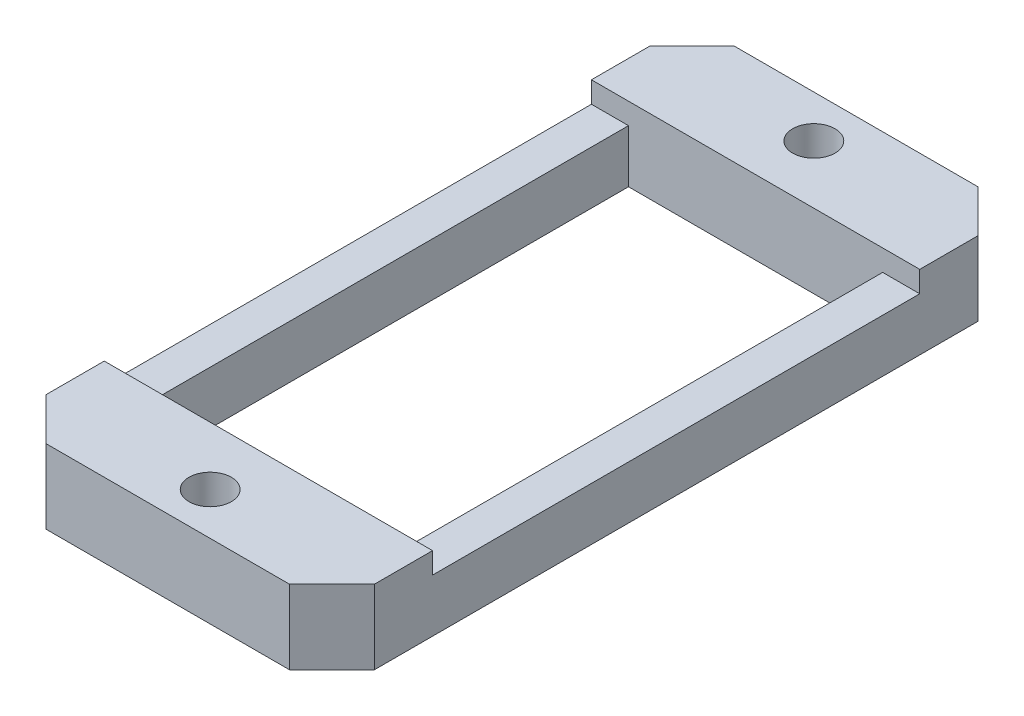
ISO-10303-21;
HEADER;
FILE_DESCRIPTION(('STEP AP214'),'2;1');
FILE_NAME('part.step','',(''),(''),'','','');
FILE_SCHEMA(('AUTOMOTIVE_DESIGN { 1 0 10303 214 1 1 1 1 }'));
ENDSEC;
DATA;
#1=APPLICATION_CONTEXT('core data for automotive mechanical design processes');
#2=APPLICATION_PROTOCOL_DEFINITION('international standard','automotive_design',2000,#1);
#3=PRODUCT_CONTEXT('',#1,'mechanical');
#4=PRODUCT('Part','Part','',(#3));
#5=PRODUCT_RELATED_PRODUCT_CATEGORY('part','',(#4));
#6=PRODUCT_DEFINITION_FORMATION('','',#4);
#7=PRODUCT_DEFINITION_CONTEXT('part definition',#1,'design');
#8=PRODUCT_DEFINITION('design','',#6,#7);
#9=PRODUCT_DEFINITION_SHAPE('','',#8);
#10=(LENGTH_UNIT() NAMED_UNIT(*) SI_UNIT(.MILLI.,.METRE.));
#11=(NAMED_UNIT(*) PLANE_ANGLE_UNIT() SI_UNIT($,.RADIAN.));
#12=(NAMED_UNIT(*) SI_UNIT($,.STERADIAN.) SOLID_ANGLE_UNIT());
#13=UNCERTAINTY_MEASURE_WITH_UNIT(LENGTH_MEASURE(1.E-05),#10,'distance_accuracy_value','');
#14=(GEOMETRIC_REPRESENTATION_CONTEXT(3) GLOBAL_UNCERTAINTY_ASSIGNED_CONTEXT((#13)) GLOBAL_UNIT_ASSIGNED_CONTEXT((#10,
#11,#12)) REPRESENTATION_CONTEXT('',''));
#15=CARTESIAN_POINT('',(0.,0.,0.));
#16=DIRECTION('',(0.,0.,1.));
#17=DIRECTION('',(1.,0.,0.));
#18=AXIS2_PLACEMENT_3D('',#15,#16,#17);
#19=CARTESIAN_POINT('',(7.75,2.5,-4.75));
#20=DIRECTION('',(0.,-1.,0.));
#21=DIRECTION('',(0.,0.,-1.));
#22=AXIS2_PLACEMENT_3D('',#19,#20,#21);
#23=PLANE('',#22);
#24=DIRECTION('',(-1.,0.,0.));
#25=VECTOR('',#24,1.);
#26=CARTESIAN_POINT('',(7.75,2.5,-27.75));
#27=LINE('',#26,#25);
#28=CARTESIAN_POINT('',(7.75,2.5,-27.75));
#29=VERTEX_POINT('',#28);
#30=CARTESIAN_POINT('',(6.,2.5,-27.75));
#31=VERTEX_POINT('',#30);
#32=EDGE_CURVE('E256',#29,#31,#27,.T.);
#33=ORIENTED_EDGE('',*,*,#32,.T.);
#34=DIRECTION('',(0.,0.,1.));
#35=VECTOR('',#34,1.);
#36=CARTESIAN_POINT('',(6.,2.5,-4.75));
#37=LINE('',#36,#35);
#38=CARTESIAN_POINT('',(6.,2.5,-4.75));
#39=VERTEX_POINT('',#38);
#40=EDGE_CURVE('E198',#31,#39,#37,.T.);
#41=ORIENTED_EDGE('',*,*,#40,.T.);
#42=DIRECTION('',(-1.,0.,0.));
#43=VECTOR('',#42,1.);
#44=CARTESIAN_POINT('',(7.75,2.5,-4.75));
#45=LINE('',#44,#43);
#46=CARTESIAN_POINT('',(7.75,2.5,-4.75));
#47=VERTEX_POINT('',#46);
#48=EDGE_CURVE('E252',#47,#39,#45,.T.);
#49=ORIENTED_EDGE('',*,*,#48,.F.);
#50=DIRECTION('',(0.,0.,1.));
#51=VECTOR('',#50,1.);
#52=CARTESIAN_POINT('',(7.75,2.5,-4.75));
#53=LINE('',#52,#51);
#54=EDGE_CURVE('E214',#29,#47,#53,.T.);
#55=ORIENTED_EDGE('',*,*,#54,.F.);
#56=EDGE_LOOP('',(#33,#41,#49,#55));
#57=FACE_BOUND('',#56,.T.);
#58=ADVANCED_FACE('F39',(#57),#23,.F.);
#59=CARTESIAN_POINT('',(7.75,0.,0.));
#60=DIRECTION('',(0.,0.,-1.));
#61=DIRECTION('',(-1.,0.,0.));
#62=AXIS2_PLACEMENT_3D('',#59,#60,#61);
#63=PLANE('',#62);
#64=DIRECTION('',(-1.,0.,0.));
#65=VECTOR('',#64,1.);
#66=CARTESIAN_POINT('',(7.75,3.5,0.));
#67=LINE('',#66,#65);
#68=CARTESIAN_POINT('',(5.74999999999999,3.5,0.));
#69=VERTEX_POINT('',#68);
#70=CARTESIAN_POINT('',(-5.74999999999999,3.5,0.));
#71=VERTEX_POINT('',#70);
#72=EDGE_CURVE('E224',#69,#71,#67,.T.);
#73=ORIENTED_EDGE('',*,*,#72,.T.);
#74=DIRECTION('',(0.,-1.,0.));
#75=VECTOR('',#74,1.);
#76=CARTESIAN_POINT('',(-5.74999999999999,0.,0.));
#77=LINE('',#76,#75);
#78=CARTESIAN_POINT('',(-5.74999999999999,0.,0.));
#79=VERTEX_POINT('',#78);
#80=EDGE_CURVE('E279',#71,#79,#77,.T.);
#81=ORIENTED_EDGE('',*,*,#80,.T.);
#82=DIRECTION('',(-1.,0.,0.));
#83=VECTOR('',#82,1.);
#84=CARTESIAN_POINT('',(7.75,0.,0.));
#85=LINE('',#84,#83);
#86=CARTESIAN_POINT('',(5.74999999999999,0.,0.));
#87=VERTEX_POINT('',#86);
#88=EDGE_CURVE('E272',#87,#79,#85,.T.);
#89=ORIENTED_EDGE('',*,*,#88,.F.);
#90=DIRECTION('',(0.,1.,0.));
#91=VECTOR('',#90,1.);
#92=CARTESIAN_POINT('',(5.74999999999999,0.,0.));
#93=LINE('',#92,#91);
#94=EDGE_CURVE('E276',#87,#69,#93,.T.);
#95=ORIENTED_EDGE('',*,*,#94,.T.);
#96=EDGE_LOOP('',(#73,#81,#89,#95));
#97=FACE_BOUND('',#96,.T.);
#98=ADVANCED_FACE('F354',(#97),#63,.F.);
#99=CARTESIAN_POINT('',(7.75,0.,0.));
#100=DIRECTION('',(0.,1.,0.));
#101=DIRECTION('',(0.,0.,1.));
#102=AXIS2_PLACEMENT_3D('',#99,#100,#101);
#103=PLANE('',#102);
#104=CARTESIAN_POINT('',(0.,0.,-30.5));
#105=DIRECTION('',(0.,-1.,0.));
#106=DIRECTION('',(0.,0.,-1.));
#107=AXIS2_PLACEMENT_3D('',#104,#105,#106);
#108=CIRCLE('',#107,1.);
#109=CARTESIAN_POINT('',(0.,0.,-31.5));
#110=VERTEX_POINT('',#109);
#111=EDGE_CURVE('E377',#110,#110,#108,.T.);
#112=ORIENTED_EDGE('',*,*,#111,.F.);
#113=EDGE_LOOP('',(#112));
#114=FACE_BOUND('',#113,.T.);
#115=CARTESIAN_POINT('',(0.,0.,-2.));
#116=DIRECTION('',(0.,-1.,0.));
#117=DIRECTION('',(0.,0.,-1.));
#118=AXIS2_PLACEMENT_3D('',#115,#116,#117);
#119=CIRCLE('',#118,1.);
#120=CARTESIAN_POINT('',(0.,0.,-3.));
#121=VERTEX_POINT('',#120);
#122=EDGE_CURVE('E374',#121,#121,#119,.T.);
#123=ORIENTED_EDGE('',*,*,#122,.F.);
#124=EDGE_LOOP('',(#123));
#125=FACE_BOUND('',#124,.T.);
#126=DIRECTION('',(-1.,0.,0.));
#127=VECTOR('',#126,1.);
#128=CARTESIAN_POINT('',(-6.,0.,-4.75));
#129=LINE('',#128,#127);
#130=CARTESIAN_POINT('',(6.,0.,-4.75));
#131=VERTEX_POINT('',#130);
#132=CARTESIAN_POINT('',(-6.,0.,-4.75));
#133=VERTEX_POINT('',#132);
#134=EDGE_CURVE('E170',#131,#133,#129,.T.);
#135=ORIENTED_EDGE('',*,*,#134,.F.);
#136=DIRECTION('',(0.,0.,1.));
#137=VECTOR('',#136,1.);
#138=CARTESIAN_POINT('',(6.,0.,-4.75));
#139=LINE('',#138,#137);
#140=CARTESIAN_POINT('',(6.,0.,-27.75));
#141=VERTEX_POINT('',#140);
#142=EDGE_CURVE('E177',#141,#131,#139,.T.);
#143=ORIENTED_EDGE('',*,*,#142,.F.);
#144=DIRECTION('',(1.,0.,0.));
#145=VECTOR('',#144,1.);
#146=CARTESIAN_POINT('',(-6.,0.,-27.75));
#147=LINE('',#146,#145);
#148=CARTESIAN_POINT('',(-6.,0.,-27.75));
#149=VERTEX_POINT('',#148);
#150=EDGE_CURVE('E182',#149,#141,#147,.T.);
#151=ORIENTED_EDGE('',*,*,#150,.F.);
#152=DIRECTION('',(0.,0.,-1.));
#153=VECTOR('',#152,1.);
#154=CARTESIAN_POINT('',(-6.,0.,-4.75));
#155=LINE('',#154,#153);
#156=EDGE_CURVE('E158',#133,#149,#155,.T.);
#157=ORIENTED_EDGE('',*,*,#156,.F.);
#158=EDGE_LOOP('',(#135,#143,#151,#157));
#159=FACE_BOUND('',#158,.T.);
#160=ORIENTED_EDGE('',*,*,#88,.T.);
#161=DIRECTION('',(-0.707106781186548,0.,-0.707106781186548));
#162=VECTOR('',#161,1.);
#163=CARTESIAN_POINT('',(-5.74999999999999,0.,0.));
#164=LINE('',#163,#162);
#165=CARTESIAN_POINT('',(-7.75,0.,-2.00000000000001));
#166=VERTEX_POINT('',#165);
#167=EDGE_CURVE('E292',#79,#166,#164,.T.);
#168=ORIENTED_EDGE('',*,*,#167,.T.);
#169=DIRECTION('',(0.,0.,-1.));
#170=VECTOR('',#169,1.);
#171=CARTESIAN_POINT('',(-7.75,0.,0.));
#172=LINE('',#171,#170);
#173=CARTESIAN_POINT('',(-7.75,0.,-30.5));
#174=VERTEX_POINT('',#173);
#175=EDGE_CURVE('E202',#166,#174,#172,.T.);
#176=ORIENTED_EDGE('',*,*,#175,.T.);
#177=DIRECTION('',(0.707106781186548,0.,-0.707106781186548));
#178=VECTOR('',#177,1.);
#179=CARTESIAN_POINT('',(-5.74999999999999,0.,-32.5));
#180=LINE('',#179,#178);
#181=CARTESIAN_POINT('',(-5.74999999999999,0.,-32.5));
#182=VERTEX_POINT('',#181);
#183=EDGE_CURVE('E289',#174,#182,#180,.T.);
#184=ORIENTED_EDGE('',*,*,#183,.T.);
#185=DIRECTION('',(-1.,0.,0.));
#186=VECTOR('',#185,1.);
#187=CARTESIAN_POINT('',(7.75,0.,-32.5));
#188=LINE('',#187,#186);
#189=CARTESIAN_POINT('',(5.74999999999999,0.,-32.5));
#190=VERTEX_POINT('',#189);
#191=EDGE_CURVE('E268',#190,#182,#188,.T.);
#192=ORIENTED_EDGE('',*,*,#191,.F.);
#193=DIRECTION('',(-0.707106781186548,0.,-0.707106781186547));
#194=VECTOR('',#193,1.);
#195=CARTESIAN_POINT('',(7.75,0.,-30.5));
#196=LINE('',#195,#194);
#197=CARTESIAN_POINT('',(7.75,0.,-30.5));
#198=VERTEX_POINT('',#197);
#199=EDGE_CURVE('E286',#190,#198,#196,.F.);
#200=ORIENTED_EDGE('',*,*,#199,.T.);
#201=DIRECTION('',(0.,0.,-1.));
#202=VECTOR('',#201,1.);
#203=CARTESIAN_POINT('',(7.75,0.,0.));
#204=LINE('',#203,#202);
#205=CARTESIAN_POINT('',(7.75,0.,-2.00000000000001));
#206=VERTEX_POINT('',#205);
#207=EDGE_CURVE('E203',#206,#198,#204,.T.);
#208=ORIENTED_EDGE('',*,*,#207,.F.);
#209=DIRECTION('',(0.707106781186548,0.,-0.707106781186548));
#210=VECTOR('',#209,1.);
#211=CARTESIAN_POINT('',(7.75,0.,-2.00000000000001));
#212=LINE('',#211,#210);
#213=EDGE_CURVE('E283',#206,#87,#212,.F.);
#214=ORIENTED_EDGE('',*,*,#213,.T.);
#215=EDGE_LOOP('',(#160,#168,#176,#184,#192,#200,#208,#214));
#216=FACE_BOUND('',#215,.T.);
#217=ADVANCED_FACE('F179',(#114,#125,#159,#216),#103,.F.);
#218=CARTESIAN_POINT('',(7.75,0.,-32.5));
#219=DIRECTION('',(0.,0.,1.));
#220=DIRECTION('',(1.,0.,0.));
#221=AXIS2_PLACEMENT_3D('',#218,#219,#220);
#222=PLANE('',#221);
#223=ORIENTED_EDGE('',*,*,#191,.T.);
#224=DIRECTION('',(0.,1.,0.));
#225=VECTOR('',#224,1.);
#226=CARTESIAN_POINT('',(-5.74999999999999,3.5,-32.5));
#227=LINE('',#226,#225);
#228=CARTESIAN_POINT('',(-5.74999999999999,3.5,-32.5));
#229=VERTEX_POINT('',#228);
#230=EDGE_CURVE('E310',#182,#229,#227,.T.);
#231=ORIENTED_EDGE('',*,*,#230,.T.);
#232=DIRECTION('',(-1.,0.,0.));
#233=VECTOR('',#232,1.);
#234=CARTESIAN_POINT('',(7.75,3.5,-32.5));
#235=LINE('',#234,#233);
#236=CARTESIAN_POINT('',(5.74999999999999,3.5,-32.5));
#237=VERTEX_POINT('',#236);
#238=EDGE_CURVE('E264',#237,#229,#235,.T.);
#239=ORIENTED_EDGE('',*,*,#238,.F.);
#240=DIRECTION('',(0.,-1.,0.));
#241=VECTOR('',#240,1.);
#242=CARTESIAN_POINT('',(5.74999999999999,0.,-32.5));
#243=LINE('',#242,#241);
#244=EDGE_CURVE('E307',#237,#190,#243,.T.);
#245=ORIENTED_EDGE('',*,*,#244,.T.);
#246=EDGE_LOOP('',(#223,#231,#239,#245));
#247=FACE_BOUND('',#246,.T.);
#248=ADVANCED_FACE('F392',(#247),#222,.F.);
#249=CARTESIAN_POINT('',(7.75,3.5,-27.75));
#250=DIRECTION('',(0.,-1.,0.));
#251=DIRECTION('',(0.,0.,-1.));
#252=AXIS2_PLACEMENT_3D('',#249,#250,#251);
#253=PLANE('',#252);
#254=CARTESIAN_POINT('',(0.,3.5,-30.5));
#255=DIRECTION('',(0.,-1.,0.));
#256=DIRECTION('',(0.,0.,-1.));
#257=AXIS2_PLACEMENT_3D('',#254,#255,#256);
#258=CIRCLE('',#257,1.);
#259=CARTESIAN_POINT('',(0.,3.5,-31.5));
#260=VERTEX_POINT('',#259);
#261=EDGE_CURVE('E381',#260,#260,#258,.T.);
#262=ORIENTED_EDGE('',*,*,#261,.T.);
#263=EDGE_LOOP('',(#262));
#264=FACE_BOUND('',#263,.T.);
#265=ORIENTED_EDGE('',*,*,#238,.T.);
#266=DIRECTION('',(-0.707106781186548,0.,0.707106781186548));
#267=VECTOR('',#266,1.);
#268=CARTESIAN_POINT('',(-5.74999999999999,3.5,-32.5));
#269=LINE('',#268,#267);
#270=CARTESIAN_POINT('',(-7.75,3.5,-30.5));
#271=VERTEX_POINT('',#270);
#272=EDGE_CURVE('E62',#229,#271,#269,.T.);
#273=ORIENTED_EDGE('',*,*,#272,.T.);
#274=DIRECTION('',(0.,0.,1.));
#275=VECTOR('',#274,1.);
#276=CARTESIAN_POINT('',(-7.75,3.5,-27.75));
#277=LINE('',#276,#275);
#278=CARTESIAN_POINT('',(-7.75,3.5,-27.75));
#279=VERTEX_POINT('',#278);
#280=EDGE_CURVE('E228',#271,#279,#277,.T.);
#281=ORIENTED_EDGE('',*,*,#280,.T.);
#282=DIRECTION('',(-1.,0.,0.));
#283=VECTOR('',#282,1.);
#284=CARTESIAN_POINT('',(7.75,3.5,-27.75));
#285=LINE('',#284,#283);
#286=CARTESIAN_POINT('',(7.75,3.5,-27.75));
#287=VERTEX_POINT('',#286);
#288=EDGE_CURVE('E260',#287,#279,#285,.T.);
#289=ORIENTED_EDGE('',*,*,#288,.F.);
#290=DIRECTION('',(0.,0.,1.));
#291=VECTOR('',#290,1.);
#292=CARTESIAN_POINT('',(7.75,3.5,-27.75));
#293=LINE('',#292,#291);
#294=CARTESIAN_POINT('',(7.75,3.5,-30.5));
#295=VERTEX_POINT('',#294);
#296=EDGE_CURVE('E207',#295,#287,#293,.T.);
#297=ORIENTED_EDGE('',*,*,#296,.F.);
#298=DIRECTION('',(0.707106781186548,0.,0.707106781186547));
#299=VECTOR('',#298,1.);
#300=CARTESIAN_POINT('',(7.75,3.5,-30.5));
#301=LINE('',#300,#299);
#302=EDGE_CURVE('E55',#295,#237,#301,.F.);
#303=ORIENTED_EDGE('',*,*,#302,.T.);
#304=EDGE_LOOP('',(#265,#273,#281,#289,#297,#303));
#305=FACE_BOUND('',#304,.T.);
#306=ADVANCED_FACE('F332',(#264,#305),#253,.F.);
#307=CARTESIAN_POINT('',(7.75,3.5,-27.75));
#308=DIRECTION('',(0.,0.,-1.));
#309=DIRECTION('',(-1.,0.,0.));
#310=AXIS2_PLACEMENT_3D('',#307,#308,#309);
#311=PLANE('',#310);
#312=CARTESIAN_POINT('',(-6.,2.5,-27.75));
#313=VERTEX_POINT('',#312);
#314=CARTESIAN_POINT('',(-7.75,2.5,-27.75));
#315=VERTEX_POINT('',#314);
#316=EDGE_CURVE('E255',#313,#315,#27,.T.);
#317=ORIENTED_EDGE('',*,*,#316,.F.);
#318=DIRECTION('',(0.,-1.,0.));
#319=VECTOR('',#318,1.);
#320=CARTESIAN_POINT('',(-6.,3.5,-27.75));
#321=LINE('',#320,#319);
#322=EDGE_CURVE('E165',#313,#149,#321,.T.);
#323=ORIENTED_EDGE('',*,*,#322,.T.);
#324=ORIENTED_EDGE('',*,*,#150,.T.);
#325=DIRECTION('',(0.,-1.,0.));
#326=VECTOR('',#325,1.);
#327=CARTESIAN_POINT('',(6.,3.5,-27.75));
#328=LINE('',#327,#326);
#329=EDGE_CURVE('E189',#31,#141,#328,.T.);
#330=ORIENTED_EDGE('',*,*,#329,.F.);
#331=ORIENTED_EDGE('',*,*,#32,.F.);
#332=DIRECTION('',(0.,-1.,0.));
#333=VECTOR('',#332,1.);
#334=CARTESIAN_POINT('',(7.75,3.5,-27.75));
#335=LINE('',#334,#333);
#336=EDGE_CURVE('E211',#287,#29,#335,.T.);
#337=ORIENTED_EDGE('',*,*,#336,.F.);
#338=ORIENTED_EDGE('',*,*,#288,.T.);
#339=DIRECTION('',(0.,-1.,0.));
#340=VECTOR('',#339,1.);
#341=CARTESIAN_POINT('',(-7.75,3.5,-27.75));
#342=LINE('',#341,#340);
#343=EDGE_CURVE('E231',#279,#315,#342,.T.);
#344=ORIENTED_EDGE('',*,*,#343,.T.);
#345=EDGE_LOOP('',(#317,#323,#324,#330,#331,#337,#338,#344));
#346=FACE_BOUND('',#345,.T.);
#347=ADVANCED_FACE('F340',(#346),#311,.F.);
#348=CARTESIAN_POINT('',(-6.,2.5,-4.75));
#349=VERTEX_POINT('',#348);
#350=CARTESIAN_POINT('',(-7.75,2.5,-4.75));
#351=VERTEX_POINT('',#350);
#352=EDGE_CURVE('E251',#349,#351,#45,.T.);
#353=ORIENTED_EDGE('',*,*,#352,.F.);
#354=DIRECTION('',(0.,0.,-1.));
#355=VECTOR('',#354,1.);
#356=CARTESIAN_POINT('',(-6.,2.5,-4.75));
#357=LINE('',#356,#355);
#358=EDGE_CURVE('E161',#349,#313,#357,.T.);
#359=ORIENTED_EDGE('',*,*,#358,.T.);
#360=ORIENTED_EDGE('',*,*,#316,.T.);
#361=DIRECTION('',(0.,0.,1.));
#362=VECTOR('',#361,1.);
#363=CARTESIAN_POINT('',(-7.75,2.5,-4.75));
#364=LINE('',#363,#362);
#365=EDGE_CURVE('E235',#315,#351,#364,.T.);
#366=ORIENTED_EDGE('',*,*,#365,.T.);
#367=EDGE_LOOP('',(#353,#359,#360,#366));
#368=FACE_BOUND('',#367,.T.);
#369=ADVANCED_FACE('F366',(#368),#23,.F.);
#370=CARTESIAN_POINT('',(7.75,3.5,-4.75));
#371=DIRECTION('',(0.,0.,1.));
#372=DIRECTION('',(1.,0.,0.));
#373=AXIS2_PLACEMENT_3D('',#370,#371,#372);
#374=PLANE('',#373);
#375=DIRECTION('',(0.,1.,0.));
#376=VECTOR('',#375,1.);
#377=CARTESIAN_POINT('',(-7.75,3.5,-4.75));
#378=LINE('',#377,#376);
#379=CARTESIAN_POINT('',(-7.75,3.5,-4.75));
#380=VERTEX_POINT('',#379);
#381=EDGE_CURVE('E239',#351,#380,#378,.T.);
#382=ORIENTED_EDGE('',*,*,#381,.T.);
#383=DIRECTION('',(-1.,0.,0.));
#384=VECTOR('',#383,1.);
#385=CARTESIAN_POINT('',(7.75,3.5,-4.75));
#386=LINE('',#385,#384);
#387=CARTESIAN_POINT('',(7.75,3.5,-4.75));
#388=VERTEX_POINT('',#387);
#389=EDGE_CURVE('E248',#388,#380,#386,.T.);
#390=ORIENTED_EDGE('',*,*,#389,.F.);
#391=DIRECTION('',(0.,1.,0.));
#392=VECTOR('',#391,1.);
#393=CARTESIAN_POINT('',(7.75,3.5,-4.75));
#394=LINE('',#393,#392);
#395=EDGE_CURVE('E217',#47,#388,#394,.T.);
#396=ORIENTED_EDGE('',*,*,#395,.F.);
#397=ORIENTED_EDGE('',*,*,#48,.T.);
#398=DIRECTION('',(0.,-1.,0.));
#399=VECTOR('',#398,1.);
#400=CARTESIAN_POINT('',(6.,3.5,-4.75));
#401=LINE('',#400,#399);
#402=EDGE_CURVE('E166',#39,#131,#401,.T.);
#403=ORIENTED_EDGE('',*,*,#402,.T.);
#404=ORIENTED_EDGE('',*,*,#134,.T.);
#405=DIRECTION('',(0.,-1.,0.));
#406=VECTOR('',#405,1.);
#407=CARTESIAN_POINT('',(-6.,3.5,-4.75));
#408=LINE('',#407,#406);
#409=EDGE_CURVE('E154',#349,#133,#408,.T.);
#410=ORIENTED_EDGE('',*,*,#409,.F.);
#411=ORIENTED_EDGE('',*,*,#352,.T.);
#412=EDGE_LOOP('',(#382,#390,#396,#397,#403,#404,#410,#411));
#413=FACE_BOUND('',#412,.T.);
#414=ADVANCED_FACE('F172',(#413),#374,.F.);
#415=CARTESIAN_POINT('',(7.75,3.5,0.));
#416=DIRECTION('',(0.,-1.,0.));
#417=DIRECTION('',(0.,0.,-1.));
#418=AXIS2_PLACEMENT_3D('',#415,#416,#417);
#419=PLANE('',#418);
#420=CARTESIAN_POINT('',(0.,3.5,-2.));
#421=DIRECTION('',(0.,-1.,0.));
#422=DIRECTION('',(0.,0.,-1.));
#423=AXIS2_PLACEMENT_3D('',#420,#421,#422);
#424=CIRCLE('',#423,1.);
#425=CARTESIAN_POINT('',(0.,3.5,-3.));
#426=VERTEX_POINT('',#425);
#427=EDGE_CURVE('E371',#426,#426,#424,.T.);
#428=ORIENTED_EDGE('',*,*,#427,.T.);
#429=EDGE_LOOP('',(#428));
#430=FACE_BOUND('',#429,.T.);
#431=DIRECTION('',(0.,0.,1.));
#432=VECTOR('',#431,1.);
#433=CARTESIAN_POINT('',(-7.75,3.5,0.));
#434=LINE('',#433,#432);
#435=CARTESIAN_POINT('',(-7.75,3.5,-2.00000000000001));
#436=VERTEX_POINT('',#435);
#437=EDGE_CURVE('E208',#380,#436,#434,.T.);
#438=ORIENTED_EDGE('',*,*,#437,.T.);
#439=DIRECTION('',(0.707106781186548,0.,0.707106781186548));
#440=VECTOR('',#439,1.);
#441=CARTESIAN_POINT('',(-5.74999999999999,3.5,0.));
#442=LINE('',#441,#440);
#443=EDGE_CURVE('E304',#436,#71,#442,.T.);
#444=ORIENTED_EDGE('',*,*,#443,.T.);
#445=ORIENTED_EDGE('',*,*,#72,.F.);
#446=DIRECTION('',(-0.707106781186548,0.,0.707106781186548));
#447=VECTOR('',#446,1.);
#448=CARTESIAN_POINT('',(7.75,3.5,-2.00000000000001));
#449=LINE('',#448,#447);
#450=CARTESIAN_POINT('',(7.75,3.5,-2.00000000000001));
#451=VERTEX_POINT('',#450);
#452=EDGE_CURVE('E301',#69,#451,#449,.F.);
#453=ORIENTED_EDGE('',*,*,#452,.T.);
#454=DIRECTION('',(0.,0.,1.));
#455=VECTOR('',#454,1.);
#456=CARTESIAN_POINT('',(7.75,3.5,0.));
#457=LINE('',#456,#455);
#458=EDGE_CURVE('E220',#388,#451,#457,.T.);
#459=ORIENTED_EDGE('',*,*,#458,.F.);
#460=ORIENTED_EDGE('',*,*,#389,.T.);
#461=EDGE_LOOP('',(#438,#444,#445,#453,#459,#460));
#462=FACE_BOUND('',#461,.T.);
#463=ADVANCED_FACE('F350',(#430,#462),#419,.F.);
#464=CARTESIAN_POINT('',(7.75,0.,0.));
#465=DIRECTION('',(-1.,0.,0.));
#466=DIRECTION('',(0.,0.,1.));
#467=AXIS2_PLACEMENT_3D('',#464,#465,#466);
#468=PLANE('',#467);
#469=ORIENTED_EDGE('',*,*,#207,.T.);
#470=DIRECTION('',(0.,1.,0.));
#471=VECTOR('',#470,1.);
#472=CARTESIAN_POINT('',(7.75,0.,-30.5));
#473=LINE('',#472,#471);
#474=EDGE_CURVE('E11',#198,#295,#473,.T.);
#475=ORIENTED_EDGE('',*,*,#474,.T.);
#476=ORIENTED_EDGE('',*,*,#296,.T.);
#477=ORIENTED_EDGE('',*,*,#336,.T.);
#478=ORIENTED_EDGE('',*,*,#54,.T.);
#479=ORIENTED_EDGE('',*,*,#395,.T.);
#480=ORIENTED_EDGE('',*,*,#458,.T.);
#481=DIRECTION('',(0.,-1.,0.));
#482=VECTOR('',#481,1.);
#483=CARTESIAN_POINT('',(7.75,0.,-2.00000000000001));
#484=LINE('',#483,#482);
#485=EDGE_CURVE('E48',#451,#206,#484,.T.);
#486=ORIENTED_EDGE('',*,*,#485,.T.);
#487=EDGE_LOOP('',(#469,#475,#476,#477,#478,#479,#480,#486));
#488=FACE_BOUND('',#487,.T.);
#489=ADVANCED_FACE('F321',(#488),#468,.F.);
#490=CARTESIAN_POINT('',(-7.75,0.,0.));
#491=DIRECTION('',(-1.,0.,0.));
#492=DIRECTION('',(0.,0.,1.));
#493=AXIS2_PLACEMENT_3D('',#490,#491,#492);
#494=PLANE('',#493);
#495=ORIENTED_EDGE('',*,*,#175,.F.);
#496=DIRECTION('',(0.,1.,0.));
#497=VECTOR('',#496,1.);
#498=CARTESIAN_POINT('',(-7.75,3.5,-2.00000000000001));
#499=LINE('',#498,#497);
#500=EDGE_CURVE('E298',#166,#436,#499,.T.);
#501=ORIENTED_EDGE('',*,*,#500,.T.);
#502=ORIENTED_EDGE('',*,*,#437,.F.);
#503=ORIENTED_EDGE('',*,*,#381,.F.);
#504=ORIENTED_EDGE('',*,*,#365,.F.);
#505=ORIENTED_EDGE('',*,*,#343,.F.);
#506=ORIENTED_EDGE('',*,*,#280,.F.);
#507=DIRECTION('',(0.,-1.,0.));
#508=VECTOR('',#507,1.);
#509=CARTESIAN_POINT('',(-7.75,0.,-30.5));
#510=LINE('',#509,#508);
#511=EDGE_CURVE('E295',#271,#174,#510,.T.);
#512=ORIENTED_EDGE('',*,*,#511,.T.);
#513=EDGE_LOOP('',(#495,#501,#502,#503,#504,#505,#506,#512));
#514=FACE_BOUND('',#513,.T.);
#515=ADVANCED_FACE('F361',(#514),#494,.T.);
#516=CARTESIAN_POINT('',(0.,3.5,-2.));
#517=DIRECTION('',(0.,-1.,0.));
#518=DIRECTION('',(0.,0.,-1.));
#519=AXIS2_PLACEMENT_3D('',#516,#517,#518);
#520=CYLINDRICAL_SURFACE('',#519,1.);
#521=ORIENTED_EDGE('',*,*,#427,.F.);
#522=EDGE_LOOP('',(#521));
#523=FACE_BOUND('',#522,.T.);
#524=ORIENTED_EDGE('',*,*,#122,.T.);
#525=EDGE_LOOP('',(#524));
#526=FACE_BOUND('',#525,.T.);
#527=ADVANCED_FACE('F389',(#523,#526),#520,.F.);
#528=CARTESIAN_POINT('',(6.,3.5,-4.75));
#529=DIRECTION('',(1.,0.,0.));
#530=DIRECTION('',(0.,0.,-1.));
#531=AXIS2_PLACEMENT_3D('',#528,#529,#530);
#532=PLANE('',#531);
#533=ORIENTED_EDGE('',*,*,#329,.T.);
#534=ORIENTED_EDGE('',*,*,#142,.T.);
#535=ORIENTED_EDGE('',*,*,#402,.F.);
#536=ORIENTED_EDGE('',*,*,#40,.F.);
#537=EDGE_LOOP('',(#533,#534,#535,#536));
#538=FACE_BOUND('',#537,.T.);
#539=ADVANCED_FACE('F433',(#538),#532,.F.);
#540=CARTESIAN_POINT('',(-6.,3.5,-4.75));
#541=DIRECTION('',(-1.,0.,0.));
#542=DIRECTION('',(0.,0.,1.));
#543=AXIS2_PLACEMENT_3D('',#540,#541,#542);
#544=PLANE('',#543);
#545=ORIENTED_EDGE('',*,*,#409,.T.);
#546=ORIENTED_EDGE('',*,*,#156,.T.);
#547=ORIENTED_EDGE('',*,*,#322,.F.);
#548=ORIENTED_EDGE('',*,*,#358,.F.);
#549=EDGE_LOOP('',(#545,#546,#547,#548));
#550=FACE_BOUND('',#549,.T.);
#551=ADVANCED_FACE('F156',(#550),#544,.F.);
#552=CARTESIAN_POINT('',(0.,3.5,-30.5));
#553=DIRECTION('',(0.,-1.,0.));
#554=DIRECTION('',(0.,0.,-1.));
#555=AXIS2_PLACEMENT_3D('',#552,#553,#554);
#556=CYLINDRICAL_SURFACE('',#555,1.);
#557=ORIENTED_EDGE('',*,*,#261,.F.);
#558=EDGE_LOOP('',(#557));
#559=FACE_BOUND('',#558,.T.);
#560=ORIENTED_EDGE('',*,*,#111,.T.);
#561=EDGE_LOOP('',(#560));
#562=FACE_BOUND('',#561,.T.);
#563=ADVANCED_FACE('F423',(#559,#562),#556,.F.);
#564=CARTESIAN_POINT('',(-5.74999999999999,0.,0.));
#565=DIRECTION('',(-0.707106781186548,0.,0.707106781186548));
#566=DIRECTION('',(0.,1.,0.));
#567=AXIS2_PLACEMENT_3D('',#564,#565,#566);
#568=PLANE('',#567);
#569=ORIENTED_EDGE('',*,*,#443,.F.);
#570=ORIENTED_EDGE('',*,*,#500,.F.);
#571=ORIENTED_EDGE('',*,*,#167,.F.);
#572=ORIENTED_EDGE('',*,*,#80,.F.);
#573=EDGE_LOOP('',(#569,#570,#571,#572));
#574=FACE_BOUND('',#573,.T.);
#575=ADVANCED_FACE('F363',(#574),#568,.T.);
#576=CARTESIAN_POINT('',(-5.74999999999999,0.,-32.5));
#577=DIRECTION('',(-0.707106781186548,0.,-0.707106781186548));
#578=DIRECTION('',(0.,-1.,0.));
#579=AXIS2_PLACEMENT_3D('',#576,#577,#578);
#580=PLANE('',#579);
#581=ORIENTED_EDGE('',*,*,#183,.F.);
#582=ORIENTED_EDGE('',*,*,#511,.F.);
#583=ORIENTED_EDGE('',*,*,#272,.F.);
#584=ORIENTED_EDGE('',*,*,#230,.F.);
#585=EDGE_LOOP('',(#581,#582,#583,#584));
#586=FACE_BOUND('',#585,.T.);
#587=ADVANCED_FACE('F431',(#586),#580,.T.);
#588=CARTESIAN_POINT('',(7.75,0.,-30.5));
#589=DIRECTION('',(-0.707106781186547,0.,0.707106781186548));
#590=DIRECTION('',(0.,1.,0.));
#591=AXIS2_PLACEMENT_3D('',#588,#589,#590);
#592=PLANE('',#591);
#593=ORIENTED_EDGE('',*,*,#199,.F.);
#594=ORIENTED_EDGE('',*,*,#244,.F.);
#595=ORIENTED_EDGE('',*,*,#302,.F.);
#596=ORIENTED_EDGE('',*,*,#474,.F.);
#597=EDGE_LOOP('',(#593,#594,#595,#596));
#598=FACE_BOUND('',#597,.T.);
#599=ADVANCED_FACE('F328',(#598),#592,.F.);
#600=CARTESIAN_POINT('',(7.75,0.,-2.00000000000001));
#601=DIRECTION('',(-0.707106781186548,0.,-0.707106781186548));
#602=DIRECTION('',(0.,-1.,0.));
#603=AXIS2_PLACEMENT_3D('',#600,#601,#602);
#604=PLANE('',#603);
#605=ORIENTED_EDGE('',*,*,#452,.F.);
#606=ORIENTED_EDGE('',*,*,#94,.F.);
#607=ORIENTED_EDGE('',*,*,#213,.F.);
#608=ORIENTED_EDGE('',*,*,#485,.F.);
#609=EDGE_LOOP('',(#605,#606,#607,#608));
#610=FACE_BOUND('',#609,.T.);
#611=ADVANCED_FACE('F41',(#610),#604,.F.);
#612=CLOSED_SHELL('',(#58,#98,#217,#248,#306,#347,#369,#414,#463,#489,#515,#527,#539,#551,#563,
#575,#587,#599,#611));
#613=MANIFOLD_SOLID_BREP('B2',#612);
#614=ADVANCED_BREP_SHAPE_REPRESENTATION('',(#18,#613),#14);
#615=SHAPE_DEFINITION_REPRESENTATION(#9,#614);
ENDSEC;
END-ISO-10303-21;
